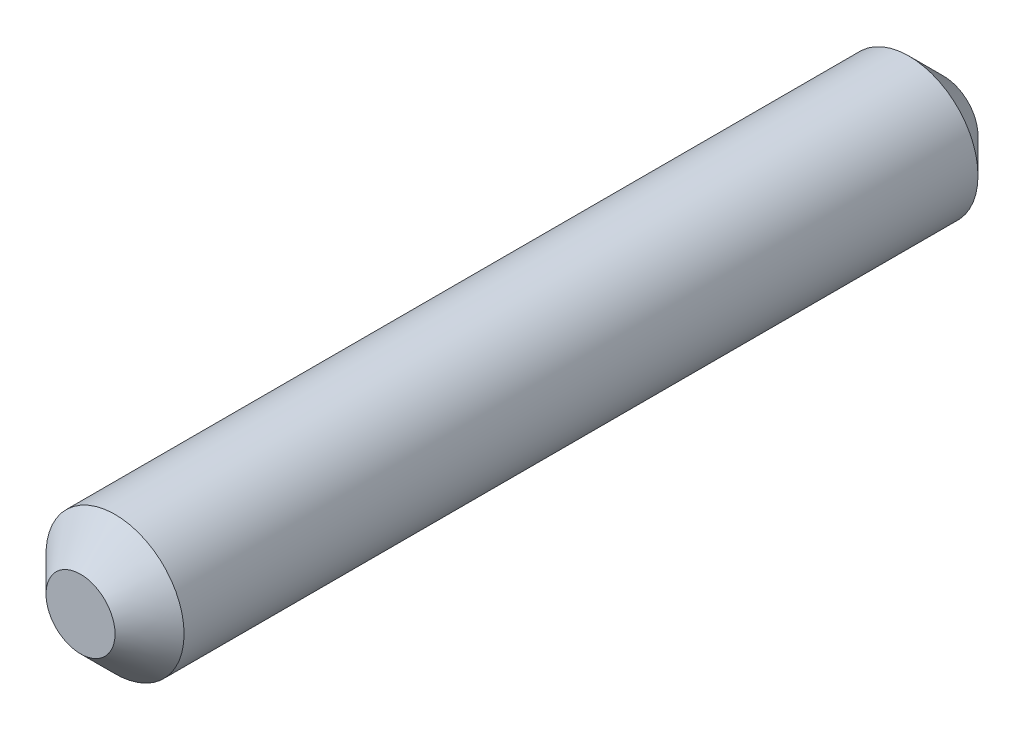
ISO-10303-21;
HEADER;
FILE_DESCRIPTION(('STEP AP214'),'2;1');
FILE_NAME('part.step','',(''),(''),'','','');
FILE_SCHEMA(('AUTOMOTIVE_DESIGN { 1 0 10303 214 1 1 1 1 }'));
ENDSEC;
DATA;
#1=APPLICATION_CONTEXT('core data for automotive mechanical design processes');
#2=APPLICATION_PROTOCOL_DEFINITION('international standard','automotive_design',2000,#1);
#3=PRODUCT_CONTEXT('',#1,'mechanical');
#4=PRODUCT('Part','Part','',(#3));
#5=PRODUCT_RELATED_PRODUCT_CATEGORY('part','',(#4));
#6=PRODUCT_DEFINITION_FORMATION('','',#4);
#7=PRODUCT_DEFINITION_CONTEXT('part definition',#1,'design');
#8=PRODUCT_DEFINITION('design','',#6,#7);
#9=PRODUCT_DEFINITION_SHAPE('','',#8);
#10=(LENGTH_UNIT() NAMED_UNIT(*) SI_UNIT(.MILLI.,.METRE.));
#11=(NAMED_UNIT(*) PLANE_ANGLE_UNIT() SI_UNIT($,.RADIAN.));
#12=(NAMED_UNIT(*) SI_UNIT($,.STERADIAN.) SOLID_ANGLE_UNIT());
#13=UNCERTAINTY_MEASURE_WITH_UNIT(LENGTH_MEASURE(1.E-05),#10,'distance_accuracy_value','');
#14=(GEOMETRIC_REPRESENTATION_CONTEXT(3) GLOBAL_UNCERTAINTY_ASSIGNED_CONTEXT((#13)) GLOBAL_UNIT_ASSIGNED_CONTEXT((#10,
#11,#12)) REPRESENTATION_CONTEXT('',''));
#15=CARTESIAN_POINT('',(0.,0.,0.));
#16=DIRECTION('',(0.,0.,1.));
#17=DIRECTION('',(1.,0.,0.));
#18=AXIS2_PLACEMENT_3D('',#15,#16,#17);
#19=CARTESIAN_POINT('',(0.,0.,25.));
#20=DIRECTION('',(0.,0.,-1.));
#21=DIRECTION('',(-1.,0.,0.));
#22=AXIS2_PLACEMENT_3D('',#19,#20,#21);
#23=CYLINDRICAL_SURFACE('',#22,2.);
#24=CARTESIAN_POINT('',(0.,0.,24.));
#25=DIRECTION('',(0.,0.,1.));
#26=DIRECTION('',(1.,0.,0.));
#27=AXIS2_PLACEMENT_3D('',#24,#25,#26);
#28=CIRCLE('',#27,2.);
#29=CARTESIAN_POINT('',(2.,0.,24.));
#30=VERTEX_POINT('',#29);
#31=EDGE_CURVE('E45',#30,#30,#28,.F.);
#32=ORIENTED_EDGE('',*,*,#31,.T.);
#33=EDGE_LOOP('',(#32));
#34=FACE_BOUND('',#33,.T.);
#35=CARTESIAN_POINT('',(0.,0.,1.00000000000001));
#36=DIRECTION('',(0.,0.,1.));
#37=DIRECTION('',(1.,0.,0.));
#38=AXIS2_PLACEMENT_3D('',#35,#36,#37);
#39=CIRCLE('',#38,2.);
#40=CARTESIAN_POINT('',(2.,0.,1.00000000000001));
#41=VERTEX_POINT('',#40);
#42=EDGE_CURVE('E50',#41,#41,#39,.T.);
#43=ORIENTED_EDGE('',*,*,#42,.T.);
#44=EDGE_LOOP('',(#43));
#45=FACE_BOUND('',#44,.T.);
#46=ADVANCED_FACE('F37',(#34,#45),#23,.T.);
#47=CARTESIAN_POINT('',(0.,0.,25.));
#48=DIRECTION('',(0.,0.,1.));
#49=DIRECTION('',(1.,0.,0.));
#50=AXIS2_PLACEMENT_3D('',#47,#48,#49);
#51=PLANE('',#50);
#52=CARTESIAN_POINT('',(0.,0.,25.));
#53=DIRECTION('',(0.,0.,1.));
#54=DIRECTION('',(1.,0.,0.));
#55=AXIS2_PLACEMENT_3D('',#52,#53,#54);
#56=CIRCLE('',#55,0.999999999999994);
#57=CARTESIAN_POINT('',(0.999999999999994,0.,25.));
#58=VERTEX_POINT('',#57);
#59=EDGE_CURVE('E55',#58,#58,#56,.T.);
#60=ORIENTED_EDGE('',*,*,#59,.T.);
#61=EDGE_LOOP('',(#60));
#62=FACE_BOUND('',#61,.T.);
#63=ADVANCED_FACE('F62',(#62),#51,.T.);
#64=CARTESIAN_POINT('',(0.,0.,0.));
#65=DIRECTION('',(0.,0.,1.));
#66=DIRECTION('',(1.,0.,0.));
#67=AXIS2_PLACEMENT_3D('',#64,#65,#66);
#68=PLANE('',#67);
#69=CARTESIAN_POINT('',(0.,0.,0.));
#70=DIRECTION('',(0.,0.,1.));
#71=DIRECTION('',(1.,0.,0.));
#72=AXIS2_PLACEMENT_3D('',#69,#70,#71);
#73=CIRCLE('',#72,0.999999999999987);
#74=CARTESIAN_POINT('',(0.999999999999987,0.,0.));
#75=VERTEX_POINT('',#74);
#76=EDGE_CURVE('E10',#75,#75,#73,.F.);
#77=ORIENTED_EDGE('',*,*,#76,.T.);
#78=EDGE_LOOP('',(#77));
#79=FACE_BOUND('',#78,.T.);
#80=ADVANCED_FACE('F66',(#79),#68,.F.);
#81=CARTESIAN_POINT('',(0.,0.,25.));
#82=DIRECTION('',(0.,0.,-1.));
#83=DIRECTION('',(-1.,0.,0.));
#84=AXIS2_PLACEMENT_3D('',#81,#82,#83);
#85=CONICAL_SURFACE('',#84,0.999999999999994,0.785398163397447);
#86=ORIENTED_EDGE('',*,*,#31,.F.);
#87=EDGE_LOOP('',(#86));
#88=FACE_BOUND('',#87,.T.);
#89=ORIENTED_EDGE('',*,*,#59,.F.);
#90=EDGE_LOOP('',(#89));
#91=FACE_BOUND('',#90,.T.);
#92=ADVANCED_FACE('F64',(#88,#91),#85,.T.);
#93=CARTESIAN_POINT('',(0.,0.,1.00000000000001));
#94=DIRECTION('',(0.,0.,1.));
#95=DIRECTION('',(1.,0.,0.));
#96=AXIS2_PLACEMENT_3D('',#93,#94,#95);
#97=CONICAL_SURFACE('',#96,2.,0.785398163397451);
#98=ORIENTED_EDGE('',*,*,#76,.F.);
#99=EDGE_LOOP('',(#98));
#100=FACE_BOUND('',#99,.T.);
#101=ORIENTED_EDGE('',*,*,#42,.F.);
#102=EDGE_LOOP('',(#101));
#103=FACE_BOUND('',#102,.T.);
#104=ADVANCED_FACE('F39',(#100,#103),#97,.T.);
#105=CLOSED_SHELL('',(#46,#63,#80,#92,#104));
#106=MANIFOLD_SOLID_BREP('B2',#105);
#107=ADVANCED_BREP_SHAPE_REPRESENTATION('',(#18,#106),#14);
#108=SHAPE_DEFINITION_REPRESENTATION(#9,#107);
ENDSEC;
END-ISO-10303-21;
